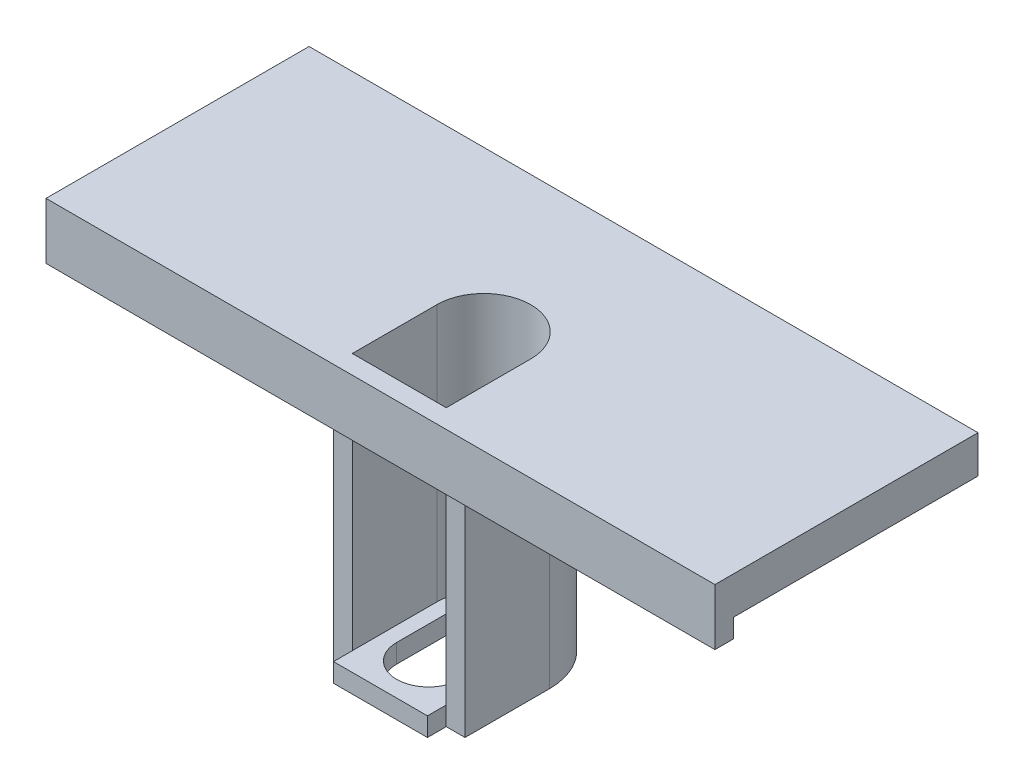
ISO-10303-21;
HEADER;
FILE_DESCRIPTION(('STEP AP214'),'2;1');
FILE_NAME('part.step','',(''),(''),'','','');
FILE_SCHEMA(('AUTOMOTIVE_DESIGN { 1 0 10303 214 1 1 1 1 }'));
ENDSEC;
DATA;
#1=APPLICATION_CONTEXT('core data for automotive mechanical design processes');
#2=APPLICATION_PROTOCOL_DEFINITION('international standard','automotive_design',2000,#1);
#3=PRODUCT_CONTEXT('',#1,'mechanical');
#4=PRODUCT('Part','Part','',(#3));
#5=PRODUCT_RELATED_PRODUCT_CATEGORY('part','',(#4));
#6=PRODUCT_DEFINITION_FORMATION('','',#4);
#7=PRODUCT_DEFINITION_CONTEXT('part definition',#1,'design');
#8=PRODUCT_DEFINITION('design','',#6,#7);
#9=PRODUCT_DEFINITION_SHAPE('','',#8);
#10=(LENGTH_UNIT() NAMED_UNIT(*) SI_UNIT(.MILLI.,.METRE.));
#11=(NAMED_UNIT(*) PLANE_ANGLE_UNIT() SI_UNIT($,.RADIAN.));
#12=(NAMED_UNIT(*) SI_UNIT($,.STERADIAN.) SOLID_ANGLE_UNIT());
#13=UNCERTAINTY_MEASURE_WITH_UNIT(LENGTH_MEASURE(1.E-05),#10,'distance_accuracy_value','');
#14=(GEOMETRIC_REPRESENTATION_CONTEXT(3) GLOBAL_UNCERTAINTY_ASSIGNED_CONTEXT((#13)) GLOBAL_UNIT_ASSIGNED_CONTEXT((#10,
#11,#12)) REPRESENTATION_CONTEXT('',''));
#15=CARTESIAN_POINT('',(0.,0.,0.));
#16=DIRECTION('',(0.,0.,1.));
#17=DIRECTION('',(1.,0.,0.));
#18=AXIS2_PLACEMENT_3D('',#15,#16,#17);
#19=CARTESIAN_POINT('',(-4.445,2.54,0.));
#20=DIRECTION('',(0.,0.,-1.));
#21=DIRECTION('',(-1.,0.,0.));
#22=AXIS2_PLACEMENT_3D('',#19,#20,#21);
#23=PLANE('',#22);
#24=DIRECTION('',(1.,0.,0.));
#25=VECTOR('',#24,1.);
#26=CARTESIAN_POINT('',(-22.606,-1.27,0.));
#27=LINE('',#26,#25);
#28=CARTESIAN_POINT('',(-4.445,-1.27,0.));
#29=VERTEX_POINT('',#28);
#30=CARTESIAN_POINT('',(-3.175,-1.27,0.));
#31=VERTEX_POINT('',#30);
#32=EDGE_CURVE('E50',#29,#31,#27,.T.);
#33=ORIENTED_EDGE('',*,*,#32,.F.);
#34=DIRECTION('',(0.,1.,0.));
#35=VECTOR('',#34,1.);
#36=CARTESIAN_POINT('',(-4.445,-16.129,0.));
#37=LINE('',#36,#35);
#38=CARTESIAN_POINT('',(-4.445,-16.129,0.));
#39=VERTEX_POINT('',#38);
#40=EDGE_CURVE('E322',#39,#29,#37,.T.);
#41=ORIENTED_EDGE('',*,*,#40,.F.);
#42=DIRECTION('',(-1.,0.,0.));
#43=VECTOR('',#42,1.);
#44=CARTESIAN_POINT('',(0.,-16.129,0.));
#45=LINE('',#44,#43);
#46=CARTESIAN_POINT('',(-3.175,-16.129,0.));
#47=VERTEX_POINT('',#46);
#48=EDGE_CURVE('E297',#47,#39,#45,.T.);
#49=ORIENTED_EDGE('',*,*,#48,.F.);
#50=DIRECTION('',(0.,1.,0.));
#51=VECTOR('',#50,1.);
#52=CARTESIAN_POINT('',(-3.175,-16.129,0.));
#53=LINE('',#52,#51);
#54=CARTESIAN_POINT('',(-3.175,-14.859,0.));
#55=VERTEX_POINT('',#54);
#56=EDGE_CURVE('E325',#47,#55,#53,.T.);
#57=ORIENTED_EDGE('',*,*,#56,.T.);
#58=EDGE_CURVE('E55',#55,#31,#53,.T.);
#59=ORIENTED_EDGE('',*,*,#58,.T.);
#60=EDGE_LOOP('',(#33,#41,#49,#57,#59));
#61=FACE_BOUND('',#60,.T.);
#62=ADVANCED_FACE('F35',(#61),#23,.F.);
#63=CARTESIAN_POINT('',(4.445,2.54,0.));
#64=DIRECTION('',(0.,0.,-1.));
#65=DIRECTION('',(-1.,0.,0.));
#66=AXIS2_PLACEMENT_3D('',#63,#64,#65);
#67=PLANE('',#66);
#68=CARTESIAN_POINT('',(3.17499999999999,-1.27,0.));
#69=VERTEX_POINT('',#68);
#70=CARTESIAN_POINT('',(4.44499999999999,-1.27,0.));
#71=VERTEX_POINT('',#70);
#72=EDGE_CURVE('E442',#69,#71,#27,.T.);
#73=ORIENTED_EDGE('',*,*,#72,.F.);
#74=DIRECTION('',(0.,1.,0.));
#75=VECTOR('',#74,1.);
#76=CARTESIAN_POINT('',(3.175,-16.129,0.));
#77=LINE('',#76,#75);
#78=CARTESIAN_POINT('',(3.175,-14.859,0.));
#79=VERTEX_POINT('',#78);
#80=EDGE_CURVE('E331',#79,#69,#77,.T.);
#81=ORIENTED_EDGE('',*,*,#80,.F.);
#82=CARTESIAN_POINT('',(3.175,-16.129,0.));
#83=VERTEX_POINT('',#82);
#84=EDGE_CURVE('E332',#83,#79,#77,.T.);
#85=ORIENTED_EDGE('',*,*,#84,.F.);
#86=DIRECTION('',(-1.,0.,0.));
#87=VECTOR('',#86,1.);
#88=CARTESIAN_POINT('',(0.,-16.129,0.));
#89=LINE('',#88,#87);
#90=CARTESIAN_POINT('',(4.445,-16.129,0.));
#91=VERTEX_POINT('',#90);
#92=EDGE_CURVE('E294',#91,#83,#89,.T.);
#93=ORIENTED_EDGE('',*,*,#92,.F.);
#94=DIRECTION('',(0.,1.,0.));
#95=VECTOR('',#94,1.);
#96=CARTESIAN_POINT('',(4.445,-16.129,0.));
#97=LINE('',#96,#95);
#98=EDGE_CURVE('E307',#91,#71,#97,.T.);
#99=ORIENTED_EDGE('',*,*,#98,.T.);
#100=EDGE_LOOP('',(#73,#81,#85,#93,#99));
#101=FACE_BOUND('',#100,.T.);
#102=ADVANCED_FACE('F444',(#101),#67,.F.);
#103=CARTESIAN_POINT('',(-22.606,2.54,-16.51));
#104=DIRECTION('',(1.,0.,0.));
#105=DIRECTION('',(0.,0.,-1.));
#106=AXIS2_PLACEMENT_3D('',#103,#104,#105);
#107=PLANE('',#106);
#108=DIRECTION('',(0.,0.,1.));
#109=VECTOR('',#108,1.);
#110=CARTESIAN_POINT('',(-22.606,0.,-16.51));
#111=LINE('',#110,#109);
#112=CARTESIAN_POINT('',(-22.606,0.,-16.51));
#113=VERTEX_POINT('',#112);
#114=CARTESIAN_POINT('',(-22.606,0.,0.));
#115=VERTEX_POINT('',#114);
#116=EDGE_CURVE('E334',#113,#115,#111,.T.);
#117=ORIENTED_EDGE('',*,*,#116,.T.);
#118=DIRECTION('',(0.,-1.,0.));
#119=VECTOR('',#118,1.);
#120=CARTESIAN_POINT('',(-22.606,2.54,0.));
#121=LINE('',#120,#119);
#122=CARTESIAN_POINT('',(-22.606,-1.27,0.));
#123=VERTEX_POINT('',#122);
#124=EDGE_CURVE('E272',#115,#123,#121,.T.);
#125=ORIENTED_EDGE('',*,*,#124,.T.);
#126=DIRECTION('',(0.,0.,-1.));
#127=VECTOR('',#126,1.);
#128=CARTESIAN_POINT('',(-22.606,-1.27,1.27));
#129=LINE('',#128,#127);
#130=CARTESIAN_POINT('',(-22.606,-1.27,1.27));
#131=VERTEX_POINT('',#130);
#132=EDGE_CURVE('E282',#131,#123,#129,.T.);
#133=ORIENTED_EDGE('',*,*,#132,.F.);
#134=DIRECTION('',(0.,-1.,0.));
#135=VECTOR('',#134,1.);
#136=CARTESIAN_POINT('',(-22.606,2.54,1.27));
#137=LINE('',#136,#135);
#138=CARTESIAN_POINT('',(-22.606,2.54,1.27));
#139=VERTEX_POINT('',#138);
#140=EDGE_CURVE('E261',#139,#131,#137,.T.);
#141=ORIENTED_EDGE('',*,*,#140,.F.);
#142=DIRECTION('',(0.,0.,1.));
#143=VECTOR('',#142,1.);
#144=CARTESIAN_POINT('',(-22.606,2.54,-16.51));
#145=LINE('',#144,#143);
#146=CARTESIAN_POINT('',(-22.606,2.54,-16.51));
#147=VERTEX_POINT('',#146);
#148=EDGE_CURVE('E335',#147,#139,#145,.T.);
#149=ORIENTED_EDGE('',*,*,#148,.F.);
#150=DIRECTION('',(0.,-1.,0.));
#151=VECTOR('',#150,1.);
#152=CARTESIAN_POINT('',(-22.606,2.54,-16.51));
#153=LINE('',#152,#151);
#154=EDGE_CURVE('E43',#147,#113,#153,.T.);
#155=ORIENTED_EDGE('',*,*,#154,.T.);
#156=EDGE_LOOP('',(#117,#125,#133,#141,#149,#155));
#157=FACE_BOUND('',#156,.T.);
#158=ADVANCED_FACE('F37',(#157),#107,.F.);
#159=CARTESIAN_POINT('',(22.606,2.54,0.));
#160=DIRECTION('',(-1.,0.,0.));
#161=DIRECTION('',(0.,0.,1.));
#162=AXIS2_PLACEMENT_3D('',#159,#160,#161);
#163=PLANE('',#162);
#164=DIRECTION('',(0.,0.,-1.));
#165=VECTOR('',#164,1.);
#166=CARTESIAN_POINT('',(22.606,0.,0.));
#167=LINE('',#166,#165);
#168=CARTESIAN_POINT('',(22.606,0.,0.));
#169=VERTEX_POINT('',#168);
#170=CARTESIAN_POINT('',(22.606,0.,-16.51));
#171=VERTEX_POINT('',#170);
#172=EDGE_CURVE('E358',#169,#171,#167,.T.);
#173=ORIENTED_EDGE('',*,*,#172,.T.);
#174=DIRECTION('',(0.,-1.,0.));
#175=VECTOR('',#174,1.);
#176=CARTESIAN_POINT('',(22.606,2.54,-16.51));
#177=LINE('',#176,#175);
#178=CARTESIAN_POINT('',(22.606,2.54,-16.51));
#179=VERTEX_POINT('',#178);
#180=EDGE_CURVE('E11',#179,#171,#177,.T.);
#181=ORIENTED_EDGE('',*,*,#180,.F.);
#182=DIRECTION('',(0.,0.,-1.));
#183=VECTOR('',#182,1.);
#184=CARTESIAN_POINT('',(22.606,2.54,0.));
#185=LINE('',#184,#183);
#186=CARTESIAN_POINT('',(22.606,2.54,1.27));
#187=VERTEX_POINT('',#186);
#188=EDGE_CURVE('E337',#187,#179,#185,.T.);
#189=ORIENTED_EDGE('',*,*,#188,.F.);
#190=DIRECTION('',(0.,1.,0.));
#191=VECTOR('',#190,1.);
#192=CARTESIAN_POINT('',(22.606,-1.27,1.27));
#193=LINE('',#192,#191);
#194=CARTESIAN_POINT('',(22.606,-1.27,1.27));
#195=VERTEX_POINT('',#194);
#196=EDGE_CURVE('E266',#195,#187,#193,.T.);
#197=ORIENTED_EDGE('',*,*,#196,.F.);
#198=DIRECTION('',(0.,0.,-1.));
#199=VECTOR('',#198,1.);
#200=CARTESIAN_POINT('',(22.606,-1.27,1.27));
#201=LINE('',#200,#199);
#202=CARTESIAN_POINT('',(22.606,-1.27,0.));
#203=VERTEX_POINT('',#202);
#204=EDGE_CURVE('E269',#195,#203,#201,.T.);
#205=ORIENTED_EDGE('',*,*,#204,.T.);
#206=DIRECTION('',(0.,1.,0.));
#207=VECTOR('',#206,1.);
#208=CARTESIAN_POINT('',(22.606,-1.27,0.));
#209=LINE('',#208,#207);
#210=EDGE_CURVE('E262',#203,#169,#209,.T.);
#211=ORIENTED_EDGE('',*,*,#210,.T.);
#212=EDGE_LOOP('',(#173,#181,#189,#197,#205,#211));
#213=FACE_BOUND('',#212,.T.);
#214=ADVANCED_FACE('F391',(#213),#163,.F.);
#215=CARTESIAN_POINT('',(22.606,2.54,-16.51));
#216=DIRECTION('',(0.,0.,1.));
#217=DIRECTION('',(1.,0.,0.));
#218=AXIS2_PLACEMENT_3D('',#215,#216,#217);
#219=PLANE('',#218);
#220=DIRECTION('',(-1.,0.,0.));
#221=VECTOR('',#220,1.);
#222=CARTESIAN_POINT('',(22.606,0.,-16.51));
#223=LINE('',#222,#221);
#224=EDGE_CURVE('E338',#171,#113,#223,.T.);
#225=ORIENTED_EDGE('',*,*,#224,.T.);
#226=ORIENTED_EDGE('',*,*,#154,.F.);
#227=DIRECTION('',(-1.,0.,0.));
#228=VECTOR('',#227,1.);
#229=CARTESIAN_POINT('',(22.606,2.54,-16.51));
#230=LINE('',#229,#228);
#231=EDGE_CURVE('E340',#179,#147,#230,.T.);
#232=ORIENTED_EDGE('',*,*,#231,.F.);
#233=ORIENTED_EDGE('',*,*,#180,.T.);
#234=EDGE_LOOP('',(#225,#226,#232,#233));
#235=FACE_BOUND('',#234,.T.);
#236=ADVANCED_FACE('F389',(#235),#219,.F.);
#237=CARTESIAN_POINT('',(0.,2.54,-5.715));
#238=DIRECTION('',(0.,1.,0.));
#239=DIRECTION('',(0.,0.,1.));
#240=AXIS2_PLACEMENT_3D('',#237,#238,#239);
#241=PLANE('',#240);
#242=DIRECTION('',(-1.,0.,0.));
#243=VECTOR('',#242,1.);
#244=CARTESIAN_POINT('',(22.606,2.54,0.));
#245=LINE('',#244,#243);
#246=CARTESIAN_POINT('',(3.175,2.54,0.));
#247=VERTEX_POINT('',#246);
#248=CARTESIAN_POINT('',(-3.17499999999999,2.54,0.));
#249=VERTEX_POINT('',#248);
#250=EDGE_CURVE('E257',#247,#249,#245,.T.);
#251=ORIENTED_EDGE('',*,*,#250,.T.);
#252=DIRECTION('',(0.,0.,1.));
#253=VECTOR('',#252,1.);
#254=CARTESIAN_POINT('',(-3.175,2.54,-5.715));
#255=LINE('',#254,#253);
#256=CARTESIAN_POINT('',(-3.175,2.54,-5.715));
#257=VERTEX_POINT('',#256);
#258=EDGE_CURVE('E298',#257,#249,#255,.T.);
#259=ORIENTED_EDGE('',*,*,#258,.F.);
#260=CARTESIAN_POINT('',(0.,2.54,-5.715));
#261=DIRECTION('',(0.,1.,0.));
#262=DIRECTION('',(0.,0.,1.));
#263=AXIS2_PLACEMENT_3D('',#260,#261,#262);
#264=CIRCLE('',#263,3.175);
#265=CARTESIAN_POINT('',(3.175,2.54,-5.715));
#266=VERTEX_POINT('',#265);
#267=EDGE_CURVE('E310',#266,#257,#264,.T.);
#268=ORIENTED_EDGE('',*,*,#267,.F.);
#269=DIRECTION('',(0.,0.,-1.));
#270=VECTOR('',#269,1.);
#271=CARTESIAN_POINT('',(3.175,2.54,-5.715));
#272=LINE('',#271,#270);
#273=EDGE_CURVE('E293',#247,#266,#272,.T.);
#274=ORIENTED_EDGE('',*,*,#273,.F.);
#275=EDGE_LOOP('',(#251,#259,#268,#274));
#276=FACE_BOUND('',#275,.T.);
#277=ORIENTED_EDGE('',*,*,#148,.T.);
#278=DIRECTION('',(-1.,0.,0.));
#279=VECTOR('',#278,1.);
#280=CARTESIAN_POINT('',(22.606,2.54,1.27));
#281=LINE('',#280,#279);
#282=EDGE_CURVE('E258',#187,#139,#281,.T.);
#283=ORIENTED_EDGE('',*,*,#282,.F.);
#284=ORIENTED_EDGE('',*,*,#188,.T.);
#285=ORIENTED_EDGE('',*,*,#231,.T.);
#286=EDGE_LOOP('',(#277,#283,#284,#285));
#287=FACE_BOUND('',#286,.T.);
#288=ADVANCED_FACE('F387',(#276,#287),#241,.T.);
#289=CARTESIAN_POINT('',(0.,0.,-5.715));
#290=DIRECTION('',(0.,1.,0.));
#291=DIRECTION('',(0.,0.,1.));
#292=AXIS2_PLACEMENT_3D('',#289,#290,#291);
#293=PLANE('',#292);
#294=ORIENTED_EDGE('',*,*,#116,.F.);
#295=ORIENTED_EDGE('',*,*,#224,.F.);
#296=ORIENTED_EDGE('',*,*,#172,.F.);
#297=DIRECTION('',(1.,0.,0.));
#298=VECTOR('',#297,1.);
#299=CARTESIAN_POINT('',(4.445,0.,0.));
#300=LINE('',#299,#298);
#301=CARTESIAN_POINT('',(4.445,0.,0.));
#302=VERTEX_POINT('',#301);
#303=EDGE_CURVE('E356',#302,#169,#300,.T.);
#304=ORIENTED_EDGE('',*,*,#303,.F.);
#305=DIRECTION('',(0.,0.,1.));
#306=VECTOR('',#305,1.);
#307=CARTESIAN_POINT('',(4.445,0.,-5.715));
#308=LINE('',#307,#306);
#309=CARTESIAN_POINT('',(4.445,0.,-5.715));
#310=VERTEX_POINT('',#309);
#311=EDGE_CURVE('E353',#310,#302,#308,.T.);
#312=ORIENTED_EDGE('',*,*,#311,.F.);
#313=CARTESIAN_POINT('',(0.,0.,-5.715));
#314=DIRECTION('',(0.,-1.,0.));
#315=DIRECTION('',(0.,0.,1.));
#316=AXIS2_PLACEMENT_3D('',#313,#314,#315);
#317=CIRCLE('',#316,4.445);
#318=CARTESIAN_POINT('',(-4.445,0.,-5.715));
#319=VERTEX_POINT('',#318);
#320=EDGE_CURVE('E350',#319,#310,#317,.T.);
#321=ORIENTED_EDGE('',*,*,#320,.F.);
#322=DIRECTION('',(0.,0.,-1.));
#323=VECTOR('',#322,1.);
#324=CARTESIAN_POINT('',(-4.445,0.,-5.715));
#325=LINE('',#324,#323);
#326=CARTESIAN_POINT('',(-4.445,0.,0.));
#327=VERTEX_POINT('',#326);
#328=EDGE_CURVE('E347',#327,#319,#325,.T.);
#329=ORIENTED_EDGE('',*,*,#328,.F.);
#330=DIRECTION('',(1.,0.,0.));
#331=VECTOR('',#330,1.);
#332=CARTESIAN_POINT('',(-4.445,0.,0.));
#333=LINE('',#332,#331);
#334=EDGE_CURVE('E344',#115,#327,#333,.T.);
#335=ORIENTED_EDGE('',*,*,#334,.F.);
#336=EDGE_LOOP('',(#294,#295,#296,#304,#312,#321,#329,#335));
#337=FACE_BOUND('',#336,.T.);
#338=ADVANCED_FACE('F371',(#337),#293,.F.);
#339=CARTESIAN_POINT('',(-4.445,-16.129,-5.715));
#340=DIRECTION('',(1.,0.,0.));
#341=DIRECTION('',(0.,0.,-1.));
#342=AXIS2_PLACEMENT_3D('',#339,#340,#341);
#343=PLANE('',#342);
#344=ORIENTED_EDGE('',*,*,#40,.T.);
#345=DIRECTION('',(0.,-1.,0.));
#346=VECTOR('',#345,1.);
#347=CARTESIAN_POINT('',(-4.445,-16.129,0.));
#348=LINE('',#347,#346);
#349=EDGE_CURVE('E290',#327,#29,#348,.T.);
#350=ORIENTED_EDGE('',*,*,#349,.F.);
#351=ORIENTED_EDGE('',*,*,#328,.T.);
#352=DIRECTION('',(0.,1.,0.));
#353=VECTOR('',#352,1.);
#354=CARTESIAN_POINT('',(-4.445,-16.129,-5.715));
#355=LINE('',#354,#353);
#356=CARTESIAN_POINT('',(-4.445,-16.129,-5.715));
#357=VERTEX_POINT('',#356);
#358=EDGE_CURVE('E319',#357,#319,#355,.T.);
#359=ORIENTED_EDGE('',*,*,#358,.F.);
#360=DIRECTION('',(0.,0.,-1.));
#361=VECTOR('',#360,1.);
#362=CARTESIAN_POINT('',(-4.445,-16.129,-5.715));
#363=LINE('',#362,#361);
#364=EDGE_CURVE('E300',#39,#357,#363,.T.);
#365=ORIENTED_EDGE('',*,*,#364,.F.);
#366=EDGE_LOOP('',(#344,#350,#351,#359,#365));
#367=FACE_BOUND('',#366,.T.);
#368=ADVANCED_FACE('F405',(#367),#343,.F.);
#369=CARTESIAN_POINT('',(0.,-16.129,-5.715));
#370=DIRECTION('',(0.,1.,0.));
#371=DIRECTION('',(0.,0.,1.));
#372=AXIS2_PLACEMENT_3D('',#369,#370,#371);
#373=CYLINDRICAL_SURFACE('',#372,4.445);
#374=ORIENTED_EDGE('',*,*,#320,.T.);
#375=DIRECTION('',(0.,1.,0.));
#376=VECTOR('',#375,1.);
#377=CARTESIAN_POINT('',(4.445,-16.129,-5.715));
#378=LINE('',#377,#376);
#379=CARTESIAN_POINT('',(4.445,-16.129,-5.715));
#380=VERTEX_POINT('',#379);
#381=EDGE_CURVE('E316',#380,#310,#378,.T.);
#382=ORIENTED_EDGE('',*,*,#381,.F.);
#383=CARTESIAN_POINT('',(0.,-16.129,-5.715));
#384=DIRECTION('',(0.,1.,0.));
#385=DIRECTION('',(0.,0.,1.));
#386=AXIS2_PLACEMENT_3D('',#383,#384,#385);
#387=CIRCLE('',#386,4.445);
#388=EDGE_CURVE('E302',#380,#357,#387,.T.);
#389=ORIENTED_EDGE('',*,*,#388,.T.);
#390=ORIENTED_EDGE('',*,*,#358,.T.);
#391=EDGE_LOOP('',(#374,#382,#389,#390));
#392=FACE_BOUND('',#391,.T.);
#393=ADVANCED_FACE('F402',(#392),#373,.T.);
#394=CARTESIAN_POINT('',(4.445,-16.129,-5.715));
#395=DIRECTION('',(-1.,0.,0.));
#396=DIRECTION('',(0.,0.,1.));
#397=AXIS2_PLACEMENT_3D('',#394,#395,#396);
#398=PLANE('',#397);
#399=ORIENTED_EDGE('',*,*,#381,.T.);
#400=ORIENTED_EDGE('',*,*,#311,.T.);
#401=DIRECTION('',(0.,1.,0.));
#402=VECTOR('',#401,1.);
#403=CARTESIAN_POINT('',(4.445,-16.129,0.));
#404=LINE('',#403,#402);
#405=EDGE_CURVE('E288',#71,#302,#404,.T.);
#406=ORIENTED_EDGE('',*,*,#405,.F.);
#407=ORIENTED_EDGE('',*,*,#98,.F.);
#408=DIRECTION('',(0.,0.,1.));
#409=VECTOR('',#408,1.);
#410=CARTESIAN_POINT('',(4.445,-16.129,-5.715));
#411=LINE('',#410,#409);
#412=EDGE_CURVE('E305',#380,#91,#411,.T.);
#413=ORIENTED_EDGE('',*,*,#412,.F.);
#414=EDGE_LOOP('',(#399,#400,#406,#407,#413));
#415=FACE_BOUND('',#414,.T.);
#416=ADVANCED_FACE('F397',(#415),#398,.F.);
#417=CARTESIAN_POINT('',(3.175,-16.129,-5.715));
#418=DIRECTION('',(1.,0.,0.));
#419=DIRECTION('',(0.,0.,-1.));
#420=AXIS2_PLACEMENT_3D('',#417,#418,#419);
#421=PLANE('',#420);
#422=DIRECTION('',(0.,1.,0.));
#423=VECTOR('',#422,1.);
#424=CARTESIAN_POINT('',(3.175,-16.129,-5.715));
#425=LINE('',#424,#423);
#426=CARTESIAN_POINT('',(3.175,-14.859,-5.715));
#427=VERTEX_POINT('',#426);
#428=EDGE_CURVE('E329',#427,#266,#425,.T.);
#429=ORIENTED_EDGE('',*,*,#428,.F.);
#430=DIRECTION('',(0.,0.,-1.));
#431=VECTOR('',#430,1.);
#432=CARTESIAN_POINT('',(3.175,-14.859,-5.715));
#433=LINE('',#432,#431);
#434=EDGE_CURVE('E238',#79,#427,#433,.T.);
#435=ORIENTED_EDGE('',*,*,#434,.F.);
#436=ORIENTED_EDGE('',*,*,#80,.T.);
#437=DIRECTION('',(0.,-1.,0.));
#438=VECTOR('',#437,1.);
#439=CARTESIAN_POINT('',(3.175,-16.129,0.));
#440=LINE('',#439,#438);
#441=EDGE_CURVE('E285',#247,#69,#440,.T.);
#442=ORIENTED_EDGE('',*,*,#441,.F.);
#443=ORIENTED_EDGE('',*,*,#273,.T.);
#444=EDGE_LOOP('',(#429,#435,#436,#442,#443));
#445=FACE_BOUND('',#444,.T.);
#446=ADVANCED_FACE('F437',(#445),#421,.F.);
#447=CARTESIAN_POINT('',(0.,-16.129,-5.715));
#448=DIRECTION('',(0.,1.,0.));
#449=DIRECTION('',(0.,0.,1.));
#450=AXIS2_PLACEMENT_3D('',#447,#448,#449);
#451=CYLINDRICAL_SURFACE('',#450,3.175);
#452=DIRECTION('',(0.,1.,0.));
#453=VECTOR('',#452,1.);
#454=CARTESIAN_POINT('',(-3.175,-16.129,-5.715));
#455=LINE('',#454,#453);
#456=CARTESIAN_POINT('',(-3.175,-14.859,-5.715));
#457=VERTEX_POINT('',#456);
#458=EDGE_CURVE('E327',#457,#257,#455,.T.);
#459=ORIENTED_EDGE('',*,*,#458,.F.);
#460=CARTESIAN_POINT('',(0.,-14.859,-5.715));
#461=DIRECTION('',(0.,1.,0.));
#462=DIRECTION('',(0.,0.,1.));
#463=AXIS2_PLACEMENT_3D('',#460,#461,#462);
#464=CIRCLE('',#463,3.175);
#465=EDGE_CURVE('E237',#427,#457,#464,.T.);
#466=ORIENTED_EDGE('',*,*,#465,.F.);
#467=ORIENTED_EDGE('',*,*,#428,.T.);
#468=ORIENTED_EDGE('',*,*,#267,.T.);
#469=EDGE_LOOP('',(#459,#466,#467,#468));
#470=FACE_BOUND('',#469,.T.);
#471=ADVANCED_FACE('F472',(#470),#451,.F.);
#472=CARTESIAN_POINT('',(-3.175,-16.129,-5.715));
#473=DIRECTION('',(-1.,0.,0.));
#474=DIRECTION('',(0.,0.,1.));
#475=AXIS2_PLACEMENT_3D('',#472,#473,#474);
#476=PLANE('',#475);
#477=ORIENTED_EDGE('',*,*,#58,.F.);
#478=DIRECTION('',(0.,0.,1.));
#479=VECTOR('',#478,1.);
#480=CARTESIAN_POINT('',(-3.175,-14.859,-5.715));
#481=LINE('',#480,#479);
#482=EDGE_CURVE('E241',#457,#55,#481,.T.);
#483=ORIENTED_EDGE('',*,*,#482,.F.);
#484=ORIENTED_EDGE('',*,*,#458,.T.);
#485=ORIENTED_EDGE('',*,*,#258,.T.);
#486=EDGE_CURVE('E324',#31,#249,#53,.T.);
#487=ORIENTED_EDGE('',*,*,#486,.F.);
#488=EDGE_LOOP('',(#477,#483,#484,#485,#487));
#489=FACE_BOUND('',#488,.T.);
#490=ADVANCED_FACE('F423',(#489),#476,.F.);
#491=CARTESIAN_POINT('',(0.,-16.129,-5.715));
#492=DIRECTION('',(0.,1.,0.));
#493=DIRECTION('',(0.,0.,1.));
#494=AXIS2_PLACEMENT_3D('',#491,#492,#493);
#495=PLANE('',#494);
#496=ORIENTED_EDGE('',*,*,#92,.T.);
#497=DIRECTION('',(0.,0.,-1.));
#498=VECTOR('',#497,1.);
#499=CARTESIAN_POINT('',(3.175,-16.129,-5.715));
#500=LINE('',#499,#498);
#501=CARTESIAN_POINT('',(3.175,-16.129,1.27));
#502=VERTEX_POINT('',#501);
#503=EDGE_CURVE('E210',#502,#83,#500,.T.);
#504=ORIENTED_EDGE('',*,*,#503,.F.);
#505=DIRECTION('',(1.,0.,0.));
#506=VECTOR('',#505,1.);
#507=CARTESIAN_POINT('',(0.,-16.129,1.27));
#508=LINE('',#507,#506);
#509=CARTESIAN_POINT('',(-3.175,-16.129,1.27));
#510=VERTEX_POINT('',#509);
#511=EDGE_CURVE('E250',#510,#502,#508,.T.);
#512=ORIENTED_EDGE('',*,*,#511,.F.);
#513=DIRECTION('',(0.,0.,1.));
#514=VECTOR('',#513,1.);
#515=CARTESIAN_POINT('',(-3.175,-16.129,-5.715));
#516=LINE('',#515,#514);
#517=EDGE_CURVE('E248',#47,#510,#516,.T.);
#518=ORIENTED_EDGE('',*,*,#517,.F.);
#519=ORIENTED_EDGE('',*,*,#48,.T.);
#520=ORIENTED_EDGE('',*,*,#364,.T.);
#521=ORIENTED_EDGE('',*,*,#388,.F.);
#522=ORIENTED_EDGE('',*,*,#412,.T.);
#523=EDGE_LOOP('',(#496,#504,#512,#518,#519,#520,#521,#522));
#524=FACE_BOUND('',#523,.T.);
#525=CARTESIAN_POINT('',(0.,-16.129,-5.715));
#526=DIRECTION('',(0.,1.,0.));
#527=DIRECTION('',(0.,0.,1.));
#528=AXIS2_PLACEMENT_3D('',#525,#526,#527);
#529=CIRCLE('',#528,2.159);
#530=CARTESIAN_POINT('',(2.159,-16.129,-5.715));
#531=VERTEX_POINT('',#530);
#532=CARTESIAN_POINT('',(-2.159,-16.129,-5.715));
#533=VERTEX_POINT('',#532);
#534=EDGE_CURVE('E222',#531,#533,#529,.T.);
#535=ORIENTED_EDGE('',*,*,#534,.T.);
#536=DIRECTION('',(0.,0.,1.));
#537=VECTOR('',#536,1.);
#538=CARTESIAN_POINT('',(-2.159,-16.129,-5.715));
#539=LINE('',#538,#537);
#540=CARTESIAN_POINT('',(-2.159,-16.129,-1.98290902944525));
#541=VERTEX_POINT('',#540);
#542=EDGE_CURVE('E209',#533,#541,#539,.T.);
#543=ORIENTED_EDGE('',*,*,#542,.T.);
#544=CARTESIAN_POINT('',(0.,-16.129,-1.98290902944524));
#545=DIRECTION('',(0.,1.,0.));
#546=DIRECTION('',(0.,0.,1.));
#547=AXIS2_PLACEMENT_3D('',#544,#545,#546);
#548=CIRCLE('',#547,2.159);
#549=CARTESIAN_POINT('',(2.159,-16.129,-1.98290902944524));
#550=VERTEX_POINT('',#549);
#551=EDGE_CURVE('E225',#541,#550,#548,.T.);
#552=ORIENTED_EDGE('',*,*,#551,.T.);
#553=DIRECTION('',(0.,0.,-1.));
#554=VECTOR('',#553,1.);
#555=CARTESIAN_POINT('',(2.159,-16.129,-5.715));
#556=LINE('',#555,#554);
#557=EDGE_CURVE('E203',#550,#531,#556,.T.);
#558=ORIENTED_EDGE('',*,*,#557,.T.);
#559=EDGE_LOOP('',(#535,#543,#552,#558));
#560=FACE_BOUND('',#559,.T.);
#561=ADVANCED_FACE('F410',(#524,#560),#495,.F.);
#562=CARTESIAN_POINT('',(0.,0.,0.));
#563=DIRECTION('',(0.,0.,1.));
#564=DIRECTION('',(1.,0.,0.));
#565=AXIS2_PLACEMENT_3D('',#562,#563,#564);
#566=PLANE('',#565);
#567=ORIENTED_EDGE('',*,*,#124,.F.);
#568=ORIENTED_EDGE('',*,*,#334,.T.);
#569=ORIENTED_EDGE('',*,*,#349,.T.);
#570=EDGE_CURVE('E275',#123,#29,#27,.T.);
#571=ORIENTED_EDGE('',*,*,#570,.F.);
#572=EDGE_LOOP('',(#567,#568,#569,#571));
#573=FACE_BOUND('',#572,.T.);
#574=ADVANCED_FACE('F375',(#573),#566,.F.);
#575=ORIENTED_EDGE('',*,*,#405,.T.);
#576=ORIENTED_EDGE('',*,*,#303,.T.);
#577=ORIENTED_EDGE('',*,*,#210,.F.);
#578=EDGE_CURVE('E274',#71,#203,#27,.T.);
#579=ORIENTED_EDGE('',*,*,#578,.F.);
#580=EDGE_LOOP('',(#575,#576,#577,#579));
#581=FACE_BOUND('',#580,.T.);
#582=ADVANCED_FACE('F447',(#581),#566,.F.);
#583=ORIENTED_EDGE('',*,*,#250,.F.);
#584=ORIENTED_EDGE('',*,*,#441,.T.);
#585=EDGE_CURVE('E430',#31,#69,#27,.T.);
#586=ORIENTED_EDGE('',*,*,#585,.F.);
#587=ORIENTED_EDGE('',*,*,#486,.T.);
#588=EDGE_LOOP('',(#583,#584,#586,#587));
#589=FACE_BOUND('',#588,.T.);
#590=ADVANCED_FACE('F427',(#589),#566,.F.);
#591=CARTESIAN_POINT('',(-22.606,-1.27,1.27));
#592=DIRECTION('',(0.,1.,0.));
#593=DIRECTION('',(0.,0.,1.));
#594=AXIS2_PLACEMENT_3D('',#591,#592,#593);
#595=PLANE('',#594);
#596=ORIENTED_EDGE('',*,*,#570,.T.);
#597=ORIENTED_EDGE('',*,*,#32,.T.);
#598=ORIENTED_EDGE('',*,*,#585,.T.);
#599=ORIENTED_EDGE('',*,*,#72,.T.);
#600=ORIENTED_EDGE('',*,*,#578,.T.);
#601=ORIENTED_EDGE('',*,*,#204,.F.);
#602=DIRECTION('',(1.,0.,0.));
#603=VECTOR('',#602,1.);
#604=CARTESIAN_POINT('',(-22.606,-1.27,1.27));
#605=LINE('',#604,#603);
#606=EDGE_CURVE('E264',#131,#195,#605,.T.);
#607=ORIENTED_EDGE('',*,*,#606,.F.);
#608=ORIENTED_EDGE('',*,*,#132,.T.);
#609=EDGE_LOOP('',(#596,#597,#598,#599,#600,#601,#607,#608));
#610=FACE_BOUND('',#609,.T.);
#611=ADVANCED_FACE('F380',(#610),#595,.F.);
#612=CARTESIAN_POINT('',(0.,0.,1.27));
#613=DIRECTION('',(0.,0.,1.));
#614=DIRECTION('',(1.,0.,0.));
#615=AXIS2_PLACEMENT_3D('',#612,#613,#614);
#616=PLANE('',#615);
#617=ORIENTED_EDGE('',*,*,#282,.T.);
#618=ORIENTED_EDGE('',*,*,#140,.T.);
#619=ORIENTED_EDGE('',*,*,#606,.T.);
#620=ORIENTED_EDGE('',*,*,#196,.T.);
#621=EDGE_LOOP('',(#617,#618,#619,#620));
#622=FACE_BOUND('',#621,.T.);
#623=ADVANCED_FACE('F384',(#622),#616,.T.);
#624=CARTESIAN_POINT('',(3.175,-14.859,-5.715));
#625=DIRECTION('',(-1.,0.,0.));
#626=DIRECTION('',(0.,0.,1.));
#627=AXIS2_PLACEMENT_3D('',#624,#625,#626);
#628=PLANE('',#627);
#629=ORIENTED_EDGE('',*,*,#503,.T.);
#630=ORIENTED_EDGE('',*,*,#84,.T.);
#631=CARTESIAN_POINT('',(3.175,-14.859,1.27));
#632=VERTEX_POINT('',#631);
#633=EDGE_CURVE('E234',#632,#79,#433,.T.);
#634=ORIENTED_EDGE('',*,*,#633,.F.);
#635=DIRECTION('',(0.,-1.,0.));
#636=VECTOR('',#635,1.);
#637=CARTESIAN_POINT('',(3.175,-14.859,1.27));
#638=LINE('',#637,#636);
#639=EDGE_CURVE('E246',#632,#502,#638,.T.);
#640=ORIENTED_EDGE('',*,*,#639,.T.);
#641=EDGE_LOOP('',(#629,#630,#634,#640));
#642=FACE_BOUND('',#641,.T.);
#643=ADVANCED_FACE('F489',(#642),#628,.F.);
#644=CARTESIAN_POINT('',(-3.175,-14.859,-5.715));
#645=DIRECTION('',(1.,0.,0.));
#646=DIRECTION('',(0.,0.,-1.));
#647=AXIS2_PLACEMENT_3D('',#644,#645,#646);
#648=PLANE('',#647);
#649=CARTESIAN_POINT('',(-3.175,-14.859,1.27));
#650=VERTEX_POINT('',#649);
#651=EDGE_CURVE('E240',#55,#650,#481,.T.);
#652=ORIENTED_EDGE('',*,*,#651,.F.);
#653=ORIENTED_EDGE('',*,*,#56,.F.);
#654=ORIENTED_EDGE('',*,*,#517,.T.);
#655=DIRECTION('',(0.,-1.,0.));
#656=VECTOR('',#655,1.);
#657=CARTESIAN_POINT('',(-3.175,-14.859,1.27));
#658=LINE('',#657,#656);
#659=EDGE_CURVE('E254',#650,#510,#658,.T.);
#660=ORIENTED_EDGE('',*,*,#659,.F.);
#661=EDGE_LOOP('',(#652,#653,#654,#660));
#662=FACE_BOUND('',#661,.T.);
#663=ADVANCED_FACE('F416',(#662),#648,.F.);
#664=CARTESIAN_POINT('',(0.,-14.859,-5.715));
#665=DIRECTION('',(0.,1.,0.));
#666=DIRECTION('',(0.,0.,1.));
#667=AXIS2_PLACEMENT_3D('',#664,#665,#666);
#668=PLANE('',#667);
#669=ORIENTED_EDGE('',*,*,#633,.T.);
#670=ORIENTED_EDGE('',*,*,#434,.T.);
#671=ORIENTED_EDGE('',*,*,#465,.T.);
#672=ORIENTED_EDGE('',*,*,#482,.T.);
#673=ORIENTED_EDGE('',*,*,#651,.T.);
#674=DIRECTION('',(1.,0.,0.));
#675=VECTOR('',#674,1.);
#676=CARTESIAN_POINT('',(0.,-14.859,1.27));
#677=LINE('',#676,#675);
#678=EDGE_CURVE('E244',#650,#632,#677,.T.);
#679=ORIENTED_EDGE('',*,*,#678,.T.);
#680=EDGE_LOOP('',(#669,#670,#671,#672,#673,#679));
#681=FACE_BOUND('',#680,.T.);
#682=DIRECTION('',(0.,0.,1.));
#683=VECTOR('',#682,1.);
#684=CARTESIAN_POINT('',(-2.159,-14.859,-5.715));
#685=LINE('',#684,#683);
#686=CARTESIAN_POINT('',(-2.159,-14.859,-5.715));
#687=VERTEX_POINT('',#686);
#688=CARTESIAN_POINT('',(-2.159,-14.859,-1.98290902944525));
#689=VERTEX_POINT('',#688);
#690=EDGE_CURVE('E202',#687,#689,#685,.T.);
#691=ORIENTED_EDGE('',*,*,#690,.F.);
#692=CARTESIAN_POINT('',(0.,-14.859,-5.715));
#693=DIRECTION('',(0.,1.,0.));
#694=DIRECTION('',(0.,0.,1.));
#695=AXIS2_PLACEMENT_3D('',#692,#693,#694);
#696=CIRCLE('',#695,2.159);
#697=CARTESIAN_POINT('',(2.159,-14.859,-5.715));
#698=VERTEX_POINT('',#697);
#699=EDGE_CURVE('E192',#698,#687,#696,.T.);
#700=ORIENTED_EDGE('',*,*,#699,.F.);
#701=DIRECTION('',(0.,0.,-1.));
#702=VECTOR('',#701,1.);
#703=CARTESIAN_POINT('',(2.159,-14.859,-5.715));
#704=LINE('',#703,#702);
#705=CARTESIAN_POINT('',(2.159,-14.859,-1.98290902944524));
#706=VERTEX_POINT('',#705);
#707=EDGE_CURVE('E218',#706,#698,#704,.T.);
#708=ORIENTED_EDGE('',*,*,#707,.F.);
#709=CARTESIAN_POINT('',(0.,-14.859,-1.98290902944524));
#710=DIRECTION('',(0.,1.,0.));
#711=DIRECTION('',(0.,0.,1.));
#712=AXIS2_PLACEMENT_3D('',#709,#710,#711);
#713=CIRCLE('',#712,2.159);
#714=EDGE_CURVE('E216',#689,#706,#713,.T.);
#715=ORIENTED_EDGE('',*,*,#714,.F.);
#716=EDGE_LOOP('',(#691,#700,#708,#715));
#717=FACE_BOUND('',#716,.T.);
#718=ADVANCED_FACE('F214',(#681,#717),#668,.T.);
#719=CARTESIAN_POINT('',(0.,-14.859,1.27));
#720=DIRECTION('',(0.,0.,-1.));
#721=DIRECTION('',(-1.,0.,0.));
#722=AXIS2_PLACEMENT_3D('',#719,#720,#721);
#723=PLANE('',#722);
#724=ORIENTED_EDGE('',*,*,#511,.T.);
#725=ORIENTED_EDGE('',*,*,#639,.F.);
#726=ORIENTED_EDGE('',*,*,#678,.F.);
#727=ORIENTED_EDGE('',*,*,#659,.T.);
#728=EDGE_LOOP('',(#724,#725,#726,#727));
#729=FACE_BOUND('',#728,.T.);
#730=ADVANCED_FACE('F498',(#729),#723,.F.);
#731=CARTESIAN_POINT('',(0.,-14.859,-5.715));
#732=DIRECTION('',(0.,-1.,0.));
#733=DIRECTION('',(0.,0.,-1.));
#734=AXIS2_PLACEMENT_3D('',#731,#732,#733);
#735=CYLINDRICAL_SURFACE('',#734,2.159);
#736=ORIENTED_EDGE('',*,*,#534,.F.);
#737=DIRECTION('',(0.,-1.,0.));
#738=VECTOR('',#737,1.);
#739=CARTESIAN_POINT('',(2.159,-14.859,-5.715));
#740=LINE('',#739,#738);
#741=EDGE_CURVE('E198',#698,#531,#740,.T.);
#742=ORIENTED_EDGE('',*,*,#741,.F.);
#743=ORIENTED_EDGE('',*,*,#699,.T.);
#744=DIRECTION('',(0.,-1.,0.));
#745=VECTOR('',#744,1.);
#746=CARTESIAN_POINT('',(-2.159,-14.859,-5.715));
#747=LINE('',#746,#745);
#748=EDGE_CURVE('E195',#687,#533,#747,.T.);
#749=ORIENTED_EDGE('',*,*,#748,.T.);
#750=EDGE_LOOP('',(#736,#742,#743,#749));
#751=FACE_BOUND('',#750,.T.);
#752=ADVANCED_FACE('F194',(#751),#735,.F.);
#753=CARTESIAN_POINT('',(-2.159,-14.859,-5.715));
#754=DIRECTION('',(1.,0.,0.));
#755=DIRECTION('',(0.,0.,-1.));
#756=AXIS2_PLACEMENT_3D('',#753,#754,#755);
#757=PLANE('',#756);
#758=ORIENTED_EDGE('',*,*,#542,.F.);
#759=ORIENTED_EDGE('',*,*,#748,.F.);
#760=ORIENTED_EDGE('',*,*,#690,.T.);
#761=DIRECTION('',(0.,-1.,0.));
#762=VECTOR('',#761,1.);
#763=CARTESIAN_POINT('',(-2.159,-14.859,-1.98290902944525));
#764=LINE('',#763,#762);
#765=EDGE_CURVE('E211',#689,#541,#764,.T.);
#766=ORIENTED_EDGE('',*,*,#765,.T.);
#767=EDGE_LOOP('',(#758,#759,#760,#766));
#768=FACE_BOUND('',#767,.T.);
#769=ADVANCED_FACE('F206',(#768),#757,.T.);
#770=CARTESIAN_POINT('',(0.,-14.859,-1.98290902944524));
#771=DIRECTION('',(0.,-1.,0.));
#772=DIRECTION('',(0.,0.,-1.));
#773=AXIS2_PLACEMENT_3D('',#770,#771,#772);
#774=CYLINDRICAL_SURFACE('',#773,2.159);
#775=ORIENTED_EDGE('',*,*,#551,.F.);
#776=ORIENTED_EDGE('',*,*,#765,.F.);
#777=ORIENTED_EDGE('',*,*,#714,.T.);
#778=DIRECTION('',(0.,-1.,0.));
#779=VECTOR('',#778,1.);
#780=CARTESIAN_POINT('',(2.159,-14.859,-1.98290902944524));
#781=LINE('',#780,#779);
#782=EDGE_CURVE('E231',#706,#550,#781,.T.);
#783=ORIENTED_EDGE('',*,*,#782,.T.);
#784=EDGE_LOOP('',(#775,#776,#777,#783));
#785=FACE_BOUND('',#784,.T.);
#786=ADVANCED_FACE('F508',(#785),#774,.F.);
#787=CARTESIAN_POINT('',(2.159,-14.859,-5.715));
#788=DIRECTION('',(-1.,0.,0.));
#789=DIRECTION('',(0.,0.,1.));
#790=AXIS2_PLACEMENT_3D('',#787,#788,#789);
#791=PLANE('',#790);
#792=ORIENTED_EDGE('',*,*,#557,.F.);
#793=ORIENTED_EDGE('',*,*,#782,.F.);
#794=ORIENTED_EDGE('',*,*,#707,.T.);
#795=ORIENTED_EDGE('',*,*,#741,.T.);
#796=EDGE_LOOP('',(#792,#793,#794,#795));
#797=FACE_BOUND('',#796,.T.);
#798=ADVANCED_FACE('F511',(#797),#791,.T.);
#799=CLOSED_SHELL('',(#62,#102,#158,#214,#236,#288,#338,#368,#393,#416,#446,#471,#490,#561,#574,
#582,#590,#611,#623,#643,#663,#718,#730,#752,#769,#786,#798));
#800=MANIFOLD_SOLID_BREP('B2',#799);
#801=ADVANCED_BREP_SHAPE_REPRESENTATION('',(#18,#800),#14);
#802=SHAPE_DEFINITION_REPRESENTATION(#9,#801);
ENDSEC;
END-ISO-10303-21;
